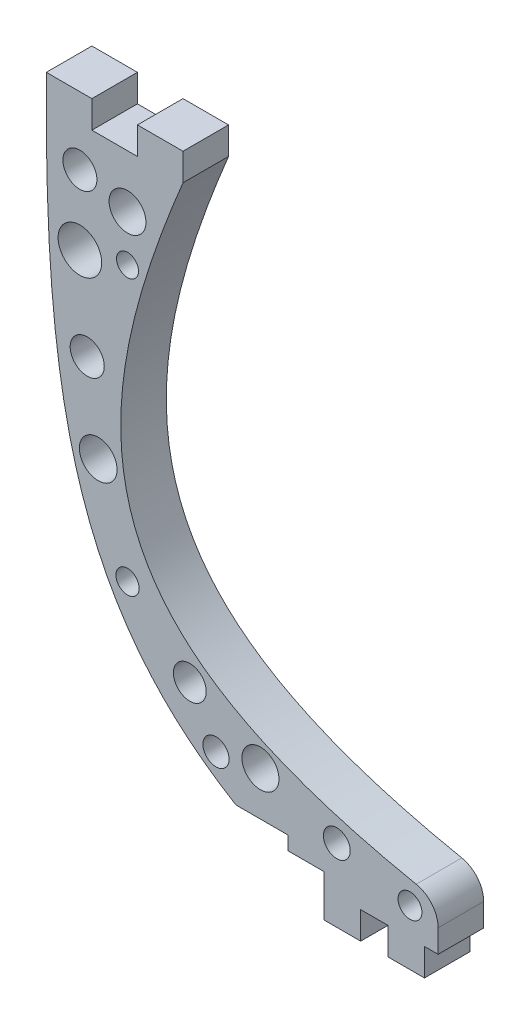
ISO-10303-21;
HEADER;
FILE_DESCRIPTION(('STEP AP214'),'2;1');
FILE_NAME('part.step','',(''),(''),'','','');
FILE_SCHEMA(('AUTOMOTIVE_DESIGN { 1 0 10303 214 1 1 1 1 }'));
ENDSEC;
DATA;
#1=APPLICATION_CONTEXT('core data for automotive mechanical design processes');
#2=APPLICATION_PROTOCOL_DEFINITION('international standard','automotive_design',2000,#1);
#3=PRODUCT_CONTEXT('',#1,'mechanical');
#4=PRODUCT('Part','Part','',(#3));
#5=PRODUCT_RELATED_PRODUCT_CATEGORY('part','',(#4));
#6=PRODUCT_DEFINITION_FORMATION('','',#4);
#7=PRODUCT_DEFINITION_CONTEXT('part definition',#1,'design');
#8=PRODUCT_DEFINITION('design','',#6,#7);
#9=PRODUCT_DEFINITION_SHAPE('','',#8);
#10=(LENGTH_UNIT() NAMED_UNIT(*) SI_UNIT(.MILLI.,.METRE.));
#11=(NAMED_UNIT(*) PLANE_ANGLE_UNIT() SI_UNIT($,.RADIAN.));
#12=(NAMED_UNIT(*) SI_UNIT($,.STERADIAN.) SOLID_ANGLE_UNIT());
#13=UNCERTAINTY_MEASURE_WITH_UNIT(LENGTH_MEASURE(1.E-05),#10,'distance_accuracy_value','');
#14=(GEOMETRIC_REPRESENTATION_CONTEXT(3) GLOBAL_UNCERTAINTY_ASSIGNED_CONTEXT((#13)) GLOBAL_UNIT_ASSIGNED_CONTEXT((#10,
#11,#12)) REPRESENTATION_CONTEXT('',''));
#15=CARTESIAN_POINT('',(0.,0.,0.));
#16=DIRECTION('',(0.,0.,1.));
#17=DIRECTION('',(1.,0.,0.));
#18=AXIS2_PLACEMENT_3D('',#15,#16,#17);
#19=CARTESIAN_POINT('',(0.,60.73,5.));
#20=DIRECTION('',(0.,-1.,0.));
#21=DIRECTION('',(1.,0.,0.));
#22=AXIS2_PLACEMENT_3D('',#19,#20,#21);
#23=PLANE('',#22);
#24=DIRECTION('',(-1.,0.,0.));
#25=VECTOR('',#24,1.);
#26=CARTESIAN_POINT('',(0.,60.73,0.));
#27=LINE('',#26,#25);
#28=CARTESIAN_POINT('',(-2.50000000000001,60.73,0.));
#29=VERTEX_POINT('',#28);
#30=CARTESIAN_POINT('',(-7.50000000000001,60.73,0.));
#31=VERTEX_POINT('',#30);
#32=EDGE_CURVE('E386',#29,#31,#27,.T.);
#33=ORIENTED_EDGE('',*,*,#32,.T.);
#34=DIRECTION('',(0.,0.,-1.));
#35=VECTOR('',#34,1.);
#36=CARTESIAN_POINT('',(-7.50000000000001,60.73,5.));
#37=LINE('',#36,#35);
#38=CARTESIAN_POINT('',(-7.50000000000001,60.73,5.));
#39=VERTEX_POINT('',#38);
#40=EDGE_CURVE('E480',#39,#31,#37,.T.);
#41=ORIENTED_EDGE('',*,*,#40,.F.);
#42=DIRECTION('',(-1.,0.,0.));
#43=VECTOR('',#42,1.);
#44=CARTESIAN_POINT('',(0.,60.73,5.));
#45=LINE('',#44,#43);
#46=CARTESIAN_POINT('',(-2.50000000000001,60.73,5.));
#47=VERTEX_POINT('',#46);
#48=EDGE_CURVE('E258',#47,#39,#45,.T.);
#49=ORIENTED_EDGE('',*,*,#48,.F.);
#50=DIRECTION('',(0.,0.,-1.));
#51=VECTOR('',#50,1.);
#52=CARTESIAN_POINT('',(-2.50000000000001,60.73,5.));
#53=LINE('',#52,#51);
#54=EDGE_CURVE('E443',#47,#29,#53,.T.);
#55=ORIENTED_EDGE('',*,*,#54,.T.);
#56=EDGE_LOOP('',(#33,#41,#49,#55));
#57=FACE_BOUND('',#56,.T.);
#58=ADVANCED_FACE('F41',(#57),#23,.F.);
#59=CARTESIAN_POINT('',(-7.4999999999999,0.,5.));
#60=DIRECTION('',(1.,0.,0.));
#61=DIRECTION('',(0.,1.,0.));
#62=AXIS2_PLACEMENT_3D('',#59,#60,#61);
#63=PLANE('',#62);
#64=DIRECTION('',(0.,-1.,0.));
#65=VECTOR('',#64,1.);
#66=CARTESIAN_POINT('',(-7.4999999999999,0.,0.));
#67=LINE('',#66,#65);
#68=CARTESIAN_POINT('',(-7.5,57.73,0.));
#69=VERTEX_POINT('',#68);
#70=EDGE_CURVE('E389',#31,#69,#67,.T.);
#71=ORIENTED_EDGE('',*,*,#70,.T.);
#72=DIRECTION('',(0.,0.,-1.));
#73=VECTOR('',#72,1.);
#74=CARTESIAN_POINT('',(-7.5,57.73,5.));
#75=LINE('',#74,#73);
#76=CARTESIAN_POINT('',(-7.5,57.73,5.));
#77=VERTEX_POINT('',#76);
#78=EDGE_CURVE('E477',#77,#69,#75,.T.);
#79=ORIENTED_EDGE('',*,*,#78,.F.);
#80=DIRECTION('',(0.,-1.,0.));
#81=VECTOR('',#80,1.);
#82=CARTESIAN_POINT('',(-7.4999999999999,0.,5.));
#83=LINE('',#82,#81);
#84=EDGE_CURVE('E261',#39,#77,#83,.T.);
#85=ORIENTED_EDGE('',*,*,#84,.F.);
#86=ORIENTED_EDGE('',*,*,#40,.T.);
#87=EDGE_LOOP('',(#71,#79,#85,#86));
#88=FACE_BOUND('',#87,.T.);
#89=ADVANCED_FACE('F280',(#88),#63,.F.);
#90=CARTESIAN_POINT('',(16.,0.,5.));
#91=CARTESIAN_POINT('',(-3.77704020854546,10.2634496775801,5.));
#92=CARTESIAN_POINT('',(-7.5,27.8008007988381,5.));
#93=CARTESIAN_POINT('',(-7.5,57.73,5.));
#94=B_SPLINE_CURVE_WITH_KNOTS('',3,(#90,#91,#92,#93),.UNSPECIFIED.,.F.,.F.,(4,4),(0.,1.),.UNSPECIFIED.);
#95=DIRECTION('',(0.,0.,-1.));
#96=VECTOR('',#95,1.);
#97=SURFACE_OF_LINEAR_EXTRUSION('',#94,#96);
#98=DIRECTION('',(0.,0.,1.));
#99=VECTOR('',#98,1.);
#100=CARTESIAN_POINT('',(13.3096736436413,1.5,0.));
#101=LINE('',#100,#99);
#102=CARTESIAN_POINT('',(13.3096736446142,1.49999999941704,0.));
#103=VERTEX_POINT('',#102);
#104=CARTESIAN_POINT('',(13.3096736436413,1.5,5.));
#105=VERTEX_POINT('',#104);
#106=EDGE_CURVE('E199',#103,#105,#101,.T.);
#107=ORIENTED_EDGE('',*,*,#106,.T.);
#108=EDGE_CURVE('E264',#105,#77,#94,.T.);
#109=ORIENTED_EDGE('',*,*,#108,.T.);
#110=ORIENTED_EDGE('',*,*,#78,.T.);
#111=CARTESIAN_POINT('',(16.,0.,0.));
#112=CARTESIAN_POINT('',(-3.77704020854546,10.2634496775801,0.));
#113=CARTESIAN_POINT('',(-7.5,27.8008007988381,0.));
#114=CARTESIAN_POINT('',(-7.5,57.73,0.));
#115=B_SPLINE_CURVE_WITH_KNOTS('',3,(#111,#112,#113,#114),.UNSPECIFIED.,.F.,.F.,(4,4),(0.,1.),.UNSPECIFIED.);
#116=EDGE_CURVE('E392',#103,#69,#115,.T.);
#117=ORIENTED_EDGE('',*,*,#116,.F.);
#118=EDGE_LOOP('',(#107,#109,#110,#117));
#119=FACE_BOUND('',#118,.T.);
#120=ADVANCED_FACE('F275',(#119),#97,.T.);
#121=CARTESIAN_POINT('',(0.,0.,5.));
#122=DIRECTION('',(0.,-1.,0.));
#123=DIRECTION('',(1.,0.,0.));
#124=AXIS2_PLACEMENT_3D('',#121,#122,#123);
#125=PLANE('',#124);
#126=DIRECTION('',(0.,0.,1.));
#127=VECTOR('',#126,1.);
#128=CARTESIAN_POINT('',(19.,0.,0.));
#129=LINE('',#128,#127);
#130=CARTESIAN_POINT('',(19.,0.,0.));
#131=VERTEX_POINT('',#130);
#132=CARTESIAN_POINT('',(19.,0.,5.));
#133=VERTEX_POINT('',#132);
#134=EDGE_CURVE('E217',#131,#133,#129,.T.);
#135=ORIENTED_EDGE('',*,*,#134,.F.);
#136=DIRECTION('',(-1.,0.,0.));
#137=VECTOR('',#136,1.);
#138=CARTESIAN_POINT('',(0.,0.,0.));
#139=LINE('',#138,#137);
#140=CARTESIAN_POINT('',(23.,0.,0.));
#141=VERTEX_POINT('',#140);
#142=EDGE_CURVE('E211',#141,#131,#139,.T.);
#143=ORIENTED_EDGE('',*,*,#142,.F.);
#144=DIRECTION('',(0.,0.,-1.));
#145=VECTOR('',#144,1.);
#146=CARTESIAN_POINT('',(23.,0.,5.));
#147=LINE('',#146,#145);
#148=CARTESIAN_POINT('',(23.,0.,5.));
#149=VERTEX_POINT('',#148);
#150=EDGE_CURVE('E475',#149,#141,#147,.T.);
#151=ORIENTED_EDGE('',*,*,#150,.F.);
#152=DIRECTION('',(-1.,0.,0.));
#153=VECTOR('',#152,1.);
#154=CARTESIAN_POINT('',(0.,0.,5.));
#155=LINE('',#154,#153);
#156=EDGE_CURVE('E269',#149,#133,#155,.T.);
#157=ORIENTED_EDGE('',*,*,#156,.T.);
#158=EDGE_LOOP('',(#135,#143,#151,#157));
#159=FACE_BOUND('',#158,.T.);
#160=ADVANCED_FACE('F279',(#159),#125,.T.);
#161=CARTESIAN_POINT('',(23.,0.,5.));
#162=DIRECTION('',(-1.,0.,0.));
#163=DIRECTION('',(0.,0.,1.));
#164=AXIS2_PLACEMENT_3D('',#161,#162,#163);
#165=PLANE('',#164);
#166=DIRECTION('',(0.,1.,0.));
#167=VECTOR('',#166,1.);
#168=CARTESIAN_POINT('',(23.,0.,0.));
#169=LINE('',#168,#167);
#170=CARTESIAN_POINT('',(23.,-4.6,0.));
#171=VERTEX_POINT('',#170);
#172=EDGE_CURVE('E400',#171,#141,#169,.T.);
#173=ORIENTED_EDGE('',*,*,#172,.F.);
#174=DIRECTION('',(0.,0.,-1.));
#175=VECTOR('',#174,1.);
#176=CARTESIAN_POINT('',(23.,-4.6,5.));
#177=LINE('',#176,#175);
#178=CARTESIAN_POINT('',(23.,-4.6,5.));
#179=VERTEX_POINT('',#178);
#180=EDGE_CURVE('E473',#179,#171,#177,.T.);
#181=ORIENTED_EDGE('',*,*,#180,.F.);
#182=DIRECTION('',(0.,1.,0.));
#183=VECTOR('',#182,1.);
#184=CARTESIAN_POINT('',(23.,0.,5.));
#185=LINE('',#184,#183);
#186=EDGE_CURVE('E596',#179,#149,#185,.T.);
#187=ORIENTED_EDGE('',*,*,#186,.T.);
#188=ORIENTED_EDGE('',*,*,#150,.T.);
#189=EDGE_LOOP('',(#173,#181,#187,#188));
#190=FACE_BOUND('',#189,.T.);
#191=ADVANCED_FACE('F577',(#190),#165,.T.);
#192=CARTESIAN_POINT('',(0.,-4.60000000000001,5.));
#193=DIRECTION('',(0.,-1.,0.));
#194=DIRECTION('',(1.,0.,0.));
#195=AXIS2_PLACEMENT_3D('',#192,#193,#194);
#196=PLANE('',#195);
#197=DIRECTION('',(-1.,0.,0.));
#198=VECTOR('',#197,1.);
#199=CARTESIAN_POINT('',(0.,-4.60000000000001,0.));
#200=LINE('',#199,#198);
#201=CARTESIAN_POINT('',(27.,-4.6,0.));
#202=VERTEX_POINT('',#201);
#203=EDGE_CURVE('E402',#202,#171,#200,.T.);
#204=ORIENTED_EDGE('',*,*,#203,.F.);
#205=DIRECTION('',(0.,0.,-1.));
#206=VECTOR('',#205,1.);
#207=CARTESIAN_POINT('',(27.,-4.6,5.));
#208=LINE('',#207,#206);
#209=CARTESIAN_POINT('',(27.,-4.6,5.));
#210=VERTEX_POINT('',#209);
#211=EDGE_CURVE('E471',#210,#202,#208,.T.);
#212=ORIENTED_EDGE('',*,*,#211,.F.);
#213=DIRECTION('',(-1.,0.,0.));
#214=VECTOR('',#213,1.);
#215=CARTESIAN_POINT('',(0.,-4.60000000000001,5.));
#216=LINE('',#215,#214);
#217=EDGE_CURVE('E592',#210,#179,#216,.T.);
#218=ORIENTED_EDGE('',*,*,#217,.T.);
#219=ORIENTED_EDGE('',*,*,#180,.T.);
#220=EDGE_LOOP('',(#204,#212,#218,#219));
#221=FACE_BOUND('',#220,.T.);
#222=ADVANCED_FACE('F574',(#221),#196,.T.);
#223=CARTESIAN_POINT('',(27.,0.,5.));
#224=DIRECTION('',(1.,0.,0.));
#225=DIRECTION('',(0.,0.,-1.));
#226=AXIS2_PLACEMENT_3D('',#223,#224,#225);
#227=PLANE('',#226);
#228=DIRECTION('',(0.,-1.,0.));
#229=VECTOR('',#228,1.);
#230=CARTESIAN_POINT('',(27.,0.,0.));
#231=LINE('',#230,#229);
#232=CARTESIAN_POINT('',(27.,-1.6,0.));
#233=VERTEX_POINT('',#232);
#234=EDGE_CURVE('E405',#233,#202,#231,.T.);
#235=ORIENTED_EDGE('',*,*,#234,.F.);
#236=DIRECTION('',(0.,0.,-1.));
#237=VECTOR('',#236,1.);
#238=CARTESIAN_POINT('',(27.,-1.6,5.));
#239=LINE('',#238,#237);
#240=CARTESIAN_POINT('',(27.,-1.6,5.));
#241=VERTEX_POINT('',#240);
#242=EDGE_CURVE('E469',#241,#233,#239,.T.);
#243=ORIENTED_EDGE('',*,*,#242,.F.);
#244=DIRECTION('',(0.,-1.,0.));
#245=VECTOR('',#244,1.);
#246=CARTESIAN_POINT('',(27.,0.,5.));
#247=LINE('',#246,#245);
#248=EDGE_CURVE('E595',#241,#210,#247,.T.);
#249=ORIENTED_EDGE('',*,*,#248,.T.);
#250=ORIENTED_EDGE('',*,*,#211,.T.);
#251=EDGE_LOOP('',(#235,#243,#249,#250));
#252=FACE_BOUND('',#251,.T.);
#253=ADVANCED_FACE('F570',(#252),#227,.T.);
#254=CARTESIAN_POINT('',(0.,-1.6,5.));
#255=DIRECTION('',(0.,-1.,0.));
#256=DIRECTION('',(0.,0.,-1.));
#257=AXIS2_PLACEMENT_3D('',#254,#255,#256);
#258=PLANE('',#257);
#259=DIRECTION('',(-1.,0.,0.));
#260=VECTOR('',#259,1.);
#261=CARTESIAN_POINT('',(0.,-1.6,0.));
#262=LINE('',#261,#260);
#263=CARTESIAN_POINT('',(30.,-1.6,0.));
#264=VERTEX_POINT('',#263);
#265=EDGE_CURVE('E408',#264,#233,#262,.T.);
#266=ORIENTED_EDGE('',*,*,#265,.F.);
#267=DIRECTION('',(0.,0.,-1.));
#268=VECTOR('',#267,1.);
#269=CARTESIAN_POINT('',(30.,-1.6,5.));
#270=LINE('',#269,#268);
#271=CARTESIAN_POINT('',(30.,-1.6,5.));
#272=VERTEX_POINT('',#271);
#273=EDGE_CURVE('E467',#272,#264,#270,.T.);
#274=ORIENTED_EDGE('',*,*,#273,.F.);
#275=DIRECTION('',(-1.,0.,0.));
#276=VECTOR('',#275,1.);
#277=CARTESIAN_POINT('',(0.,-1.6,5.));
#278=LINE('',#277,#276);
#279=EDGE_CURVE('E598',#272,#241,#278,.T.);
#280=ORIENTED_EDGE('',*,*,#279,.T.);
#281=ORIENTED_EDGE('',*,*,#242,.T.);
#282=EDGE_LOOP('',(#266,#274,#280,#281));
#283=FACE_BOUND('',#282,.T.);
#284=ADVANCED_FACE('F566',(#283),#258,.T.);
#285=CARTESIAN_POINT('',(30.,0.,5.));
#286=DIRECTION('',(-1.,0.,0.));
#287=DIRECTION('',(0.,0.,1.));
#288=AXIS2_PLACEMENT_3D('',#285,#286,#287);
#289=PLANE('',#288);
#290=DIRECTION('',(0.,1.,0.));
#291=VECTOR('',#290,1.);
#292=CARTESIAN_POINT('',(30.,0.,0.));
#293=LINE('',#292,#291);
#294=CARTESIAN_POINT('',(30.,-4.6,0.));
#295=VERTEX_POINT('',#294);
#296=EDGE_CURVE('E411',#295,#264,#293,.T.);
#297=ORIENTED_EDGE('',*,*,#296,.F.);
#298=DIRECTION('',(0.,0.,-1.));
#299=VECTOR('',#298,1.);
#300=CARTESIAN_POINT('',(30.,-4.6,5.));
#301=LINE('',#300,#299);
#302=CARTESIAN_POINT('',(30.,-4.6,5.));
#303=VERTEX_POINT('',#302);
#304=EDGE_CURVE('E465',#303,#295,#301,.T.);
#305=ORIENTED_EDGE('',*,*,#304,.F.);
#306=DIRECTION('',(0.,1.,0.));
#307=VECTOR('',#306,1.);
#308=CARTESIAN_POINT('',(30.,0.,5.));
#309=LINE('',#308,#307);
#310=EDGE_CURVE('E603',#303,#272,#309,.T.);
#311=ORIENTED_EDGE('',*,*,#310,.T.);
#312=ORIENTED_EDGE('',*,*,#273,.T.);
#313=EDGE_LOOP('',(#297,#305,#311,#312));
#314=FACE_BOUND('',#313,.T.);
#315=ADVANCED_FACE('F562',(#314),#289,.T.);
#316=CARTESIAN_POINT('',(0.,-4.59999999999999,5.));
#317=DIRECTION('',(0.,-1.,0.));
#318=DIRECTION('',(1.,0.,0.));
#319=AXIS2_PLACEMENT_3D('',#316,#317,#318);
#320=PLANE('',#319);
#321=DIRECTION('',(-1.,0.,0.));
#322=VECTOR('',#321,1.);
#323=CARTESIAN_POINT('',(0.,-4.59999999999999,0.));
#324=LINE('',#323,#322);
#325=CARTESIAN_POINT('',(34.,-4.6,0.));
#326=VERTEX_POINT('',#325);
#327=EDGE_CURVE('E414',#326,#295,#324,.T.);
#328=ORIENTED_EDGE('',*,*,#327,.F.);
#329=DIRECTION('',(0.,0.,-1.));
#330=VECTOR('',#329,1.);
#331=CARTESIAN_POINT('',(34.,-4.6,5.));
#332=LINE('',#331,#330);
#333=CARTESIAN_POINT('',(34.,-4.6,5.));
#334=VERTEX_POINT('',#333);
#335=EDGE_CURVE('E463',#334,#326,#332,.T.);
#336=ORIENTED_EDGE('',*,*,#335,.F.);
#337=DIRECTION('',(-1.,0.,0.));
#338=VECTOR('',#337,1.);
#339=CARTESIAN_POINT('',(0.,-4.59999999999999,5.));
#340=LINE('',#339,#338);
#341=EDGE_CURVE('E606',#334,#303,#340,.T.);
#342=ORIENTED_EDGE('',*,*,#341,.T.);
#343=ORIENTED_EDGE('',*,*,#304,.T.);
#344=EDGE_LOOP('',(#328,#336,#342,#343));
#345=FACE_BOUND('',#344,.T.);
#346=ADVANCED_FACE('F558',(#345),#320,.T.);
#347=CARTESIAN_POINT('',(34.,0.,5.));
#348=DIRECTION('',(-1.,0.,0.));
#349=DIRECTION('',(0.,0.,1.));
#350=AXIS2_PLACEMENT_3D('',#347,#348,#349);
#351=PLANE('',#350);
#352=DIRECTION('',(0.,1.,0.));
#353=VECTOR('',#352,1.);
#354=CARTESIAN_POINT('',(34.,0.,0.));
#355=LINE('',#354,#353);
#356=CARTESIAN_POINT('',(34.,-1.6,0.));
#357=VERTEX_POINT('',#356);
#358=EDGE_CURVE('E417',#326,#357,#355,.T.);
#359=ORIENTED_EDGE('',*,*,#358,.T.);
#360=DIRECTION('',(0.,0.,-1.));
#361=VECTOR('',#360,1.);
#362=CARTESIAN_POINT('',(34.,-1.6,5.));
#363=LINE('',#362,#361);
#364=CARTESIAN_POINT('',(34.,-1.6,5.));
#365=VERTEX_POINT('',#364);
#366=EDGE_CURVE('E460',#365,#357,#363,.T.);
#367=ORIENTED_EDGE('',*,*,#366,.F.);
#368=DIRECTION('',(0.,1.,0.));
#369=VECTOR('',#368,1.);
#370=CARTESIAN_POINT('',(34.,0.,5.));
#371=LINE('',#370,#369);
#372=EDGE_CURVE('E609',#334,#365,#371,.T.);
#373=ORIENTED_EDGE('',*,*,#372,.F.);
#374=ORIENTED_EDGE('',*,*,#335,.T.);
#375=EDGE_LOOP('',(#359,#367,#373,#374));
#376=FACE_BOUND('',#375,.T.);
#377=ADVANCED_FACE('F554',(#376),#351,.F.);
#378=CARTESIAN_POINT('',(0.,-1.60000000000005,5.));
#379=DIRECTION('',(0.,1.,0.));
#380=DIRECTION('',(-1.,0.,0.));
#381=AXIS2_PLACEMENT_3D('',#378,#379,#380);
#382=PLANE('',#381);
#383=DIRECTION('',(1.,0.,0.));
#384=VECTOR('',#383,1.);
#385=CARTESIAN_POINT('',(0.,-1.60000000000005,0.));
#386=LINE('',#385,#384);
#387=CARTESIAN_POINT('',(35.5,-1.59999999999999,0.));
#388=VERTEX_POINT('',#387);
#389=EDGE_CURVE('E419',#357,#388,#386,.T.);
#390=ORIENTED_EDGE('',*,*,#389,.T.);
#391=DIRECTION('',(0.,0.,-1.));
#392=VECTOR('',#391,1.);
#393=CARTESIAN_POINT('',(35.5,-1.59999999999999,5.));
#394=LINE('',#393,#392);
#395=CARTESIAN_POINT('',(35.5,-1.59999999999999,5.));
#396=VERTEX_POINT('',#395);
#397=EDGE_CURVE('E457',#396,#388,#394,.T.);
#398=ORIENTED_EDGE('',*,*,#397,.F.);
#399=DIRECTION('',(1.,0.,0.));
#400=VECTOR('',#399,1.);
#401=CARTESIAN_POINT('',(0.,-1.60000000000005,5.));
#402=LINE('',#401,#400);
#403=EDGE_CURVE('E611',#365,#396,#402,.T.);
#404=ORIENTED_EDGE('',*,*,#403,.F.);
#405=ORIENTED_EDGE('',*,*,#366,.T.);
#406=EDGE_LOOP('',(#390,#398,#404,#405));
#407=FACE_BOUND('',#406,.T.);
#408=ADVANCED_FACE('F551',(#407),#382,.F.);
#409=CARTESIAN_POINT('',(35.5,0.,5.));
#410=DIRECTION('',(-1.,0.,0.));
#411=DIRECTION('',(0.,0.,1.));
#412=AXIS2_PLACEMENT_3D('',#409,#410,#411);
#413=PLANE('',#412);
#414=DIRECTION('',(0.,1.,0.));
#415=VECTOR('',#414,1.);
#416=CARTESIAN_POINT('',(35.5,0.,0.));
#417=LINE('',#416,#415);
#418=CARTESIAN_POINT('',(35.5,0.92158938114513,0.));
#419=VERTEX_POINT('',#418);
#420=EDGE_CURVE('E421',#388,#419,#417,.T.);
#421=ORIENTED_EDGE('',*,*,#420,.T.);
#422=DIRECTION('',(0.,0.,-1.));
#423=VECTOR('',#422,1.);
#424=CARTESIAN_POINT('',(35.5,0.92158938114513,5.));
#425=LINE('',#424,#423);
#426=CARTESIAN_POINT('',(35.5,0.92158938114513,5.));
#427=VERTEX_POINT('',#426);
#428=EDGE_CURVE('E49',#419,#427,#425,.F.);
#429=ORIENTED_EDGE('',*,*,#428,.T.);
#430=DIRECTION('',(0.,1.,0.));
#431=VECTOR('',#430,1.);
#432=CARTESIAN_POINT('',(35.5,0.,5.));
#433=LINE('',#432,#431);
#434=EDGE_CURVE('E509',#396,#427,#433,.T.);
#435=ORIENTED_EDGE('',*,*,#434,.F.);
#436=ORIENTED_EDGE('',*,*,#397,.T.);
#437=EDGE_LOOP('',(#421,#429,#435,#436));
#438=FACE_BOUND('',#437,.T.);
#439=ADVANCED_FACE('F548',(#438),#413,.F.);
#440=CARTESIAN_POINT('',(35.5,3.40000000000001,5.));
#441=CARTESIAN_POINT('',(-1.77551263511542,10.2127809119285,5.));
#442=CARTESIAN_POINT('',(-5.56714412286545,26.4266994921749,5.));
#443=CARTESIAN_POINT('',(7.5,57.73,5.));
#444=B_SPLINE_CURVE_WITH_KNOTS('',3,(#440,#441,#442,#443),.UNSPECIFIED.,.F.,.F.,(4,4),(0.,1.),.UNSPECIFIED.);
#445=DIRECTION('',(0.,0.,-1.));
#446=VECTOR('',#445,1.);
#447=SURFACE_OF_LINEAR_EXTRUSION('',#444,#446);
#448=CARTESIAN_POINT('',(33.0935226947651,3.86229181607437,5.));
#449=VERTEX_POINT('',#448);
#450=CARTESIAN_POINT('',(7.5,57.73,5.));
#451=VERTEX_POINT('',#450);
#452=EDGE_CURVE('E491',#449,#451,#444,.T.);
#453=ORIENTED_EDGE('',*,*,#452,.F.);
#454=DIRECTION('',(0.,0.,-1.));
#455=VECTOR('',#454,1.);
#456=CARTESIAN_POINT('',(33.0935226947651,3.86229181607437,5.));
#457=LINE('',#456,#455);
#458=CARTESIAN_POINT('',(33.0935226947651,3.86229181607437,0.));
#459=VERTEX_POINT('',#458);
#460=EDGE_CURVE('E483',#449,#459,#457,.T.);
#461=ORIENTED_EDGE('',*,*,#460,.T.);
#462=CARTESIAN_POINT('',(35.5,3.40000000000001,0.));
#463=CARTESIAN_POINT('',(-1.77551263511542,10.2127809119285,0.));
#464=CARTESIAN_POINT('',(-5.56714412286545,26.4266994921749,0.));
#465=CARTESIAN_POINT('',(7.5,57.73,0.));
#466=B_SPLINE_CURVE_WITH_KNOTS('',3,(#462,#463,#464,#465),.UNSPECIFIED.,.F.,.F.,(4,4),(0.,1.),.UNSPECIFIED.);
#467=CARTESIAN_POINT('',(7.5,57.73,0.));
#468=VERTEX_POINT('',#467);
#469=EDGE_CURVE('E423',#459,#468,#466,.T.);
#470=ORIENTED_EDGE('',*,*,#469,.T.);
#471=DIRECTION('',(0.,0.,-1.));
#472=VECTOR('',#471,1.);
#473=CARTESIAN_POINT('',(7.5,57.73,5.));
#474=LINE('',#473,#472);
#475=EDGE_CURVE('E454',#451,#468,#474,.T.);
#476=ORIENTED_EDGE('',*,*,#475,.F.);
#477=EDGE_LOOP('',(#453,#461,#470,#476));
#478=FACE_BOUND('',#477,.T.);
#479=ADVANCED_FACE('F489',(#478),#447,.F.);
#480=CARTESIAN_POINT('',(7.50000000000014,0.,5.));
#481=DIRECTION('',(1.,0.,0.));
#482=DIRECTION('',(0.,1.,0.));
#483=AXIS2_PLACEMENT_3D('',#480,#481,#482);
#484=PLANE('',#483);
#485=DIRECTION('',(0.,-1.,0.));
#486=VECTOR('',#485,1.);
#487=CARTESIAN_POINT('',(7.50000000000014,0.,0.));
#488=LINE('',#487,#486);
#489=CARTESIAN_POINT('',(7.49999999999999,60.73,0.));
#490=VERTEX_POINT('',#489);
#491=EDGE_CURVE('E427',#490,#468,#488,.T.);
#492=ORIENTED_EDGE('',*,*,#491,.F.);
#493=DIRECTION('',(0.,0.,-1.));
#494=VECTOR('',#493,1.);
#495=CARTESIAN_POINT('',(7.49999999999999,60.73,5.));
#496=LINE('',#495,#494);
#497=CARTESIAN_POINT('',(7.49999999999999,60.73,5.));
#498=VERTEX_POINT('',#497);
#499=EDGE_CURVE('E452',#498,#490,#496,.T.);
#500=ORIENTED_EDGE('',*,*,#499,.F.);
#501=DIRECTION('',(0.,-1.,0.));
#502=VECTOR('',#501,1.);
#503=CARTESIAN_POINT('',(7.50000000000014,0.,5.));
#504=LINE('',#503,#502);
#505=EDGE_CURVE('E501',#498,#451,#504,.T.);
#506=ORIENTED_EDGE('',*,*,#505,.T.);
#507=ORIENTED_EDGE('',*,*,#475,.T.);
#508=EDGE_LOOP('',(#492,#500,#506,#507));
#509=FACE_BOUND('',#508,.T.);
#510=ADVANCED_FACE('F498',(#509),#484,.T.);
#511=CARTESIAN_POINT('',(0.,60.73,5.));
#512=DIRECTION('',(0.,1.,0.));
#513=DIRECTION('',(-1.,0.,0.));
#514=AXIS2_PLACEMENT_3D('',#511,#512,#513);
#515=PLANE('',#514);
#516=DIRECTION('',(1.,0.,0.));
#517=VECTOR('',#516,1.);
#518=CARTESIAN_POINT('',(0.,60.73,0.));
#519=LINE('',#518,#517);
#520=CARTESIAN_POINT('',(2.49999999999999,60.73,0.));
#521=VERTEX_POINT('',#520);
#522=EDGE_CURVE('E433',#521,#490,#519,.T.);
#523=ORIENTED_EDGE('',*,*,#522,.F.);
#524=DIRECTION('',(0.,0.,-1.));
#525=VECTOR('',#524,1.);
#526=CARTESIAN_POINT('',(2.49999999999999,60.73,5.));
#527=LINE('',#526,#525);
#528=CARTESIAN_POINT('',(2.49999999999999,60.73,5.));
#529=VERTEX_POINT('',#528);
#530=EDGE_CURVE('E450',#529,#521,#527,.T.);
#531=ORIENTED_EDGE('',*,*,#530,.F.);
#532=DIRECTION('',(1.,0.,0.));
#533=VECTOR('',#532,1.);
#534=CARTESIAN_POINT('',(0.,60.73,5.));
#535=LINE('',#534,#533);
#536=EDGE_CURVE('E505',#529,#498,#535,.T.);
#537=ORIENTED_EDGE('',*,*,#536,.T.);
#538=ORIENTED_EDGE('',*,*,#499,.T.);
#539=EDGE_LOOP('',(#523,#531,#537,#538));
#540=FACE_BOUND('',#539,.T.);
#541=ADVANCED_FACE('F535',(#540),#515,.T.);
#542=CARTESIAN_POINT('',(2.5000000000001,0.,5.));
#543=DIRECTION('',(1.,0.,0.));
#544=DIRECTION('',(0.,1.,0.));
#545=AXIS2_PLACEMENT_3D('',#542,#543,#544);
#546=PLANE('',#545);
#547=DIRECTION('',(0.,-1.,0.));
#548=VECTOR('',#547,1.);
#549=CARTESIAN_POINT('',(2.5000000000001,0.,0.));
#550=LINE('',#549,#548);
#551=CARTESIAN_POINT('',(2.5,57.73,0.));
#552=VERTEX_POINT('',#551);
#553=EDGE_CURVE('E436',#521,#552,#550,.T.);
#554=ORIENTED_EDGE('',*,*,#553,.T.);
#555=DIRECTION('',(0.,0.,-1.));
#556=VECTOR('',#555,1.);
#557=CARTESIAN_POINT('',(2.5,57.73,5.));
#558=LINE('',#557,#556);
#559=CARTESIAN_POINT('',(2.5,57.73,5.));
#560=VERTEX_POINT('',#559);
#561=EDGE_CURVE('E448',#560,#552,#558,.T.);
#562=ORIENTED_EDGE('',*,*,#561,.F.);
#563=DIRECTION('',(0.,-1.,0.));
#564=VECTOR('',#563,1.);
#565=CARTESIAN_POINT('',(2.5000000000001,0.,5.));
#566=LINE('',#565,#564);
#567=EDGE_CURVE('E507',#529,#560,#566,.T.);
#568=ORIENTED_EDGE('',*,*,#567,.F.);
#569=ORIENTED_EDGE('',*,*,#530,.T.);
#570=EDGE_LOOP('',(#554,#562,#568,#569));
#571=FACE_BOUND('',#570,.T.);
#572=ADVANCED_FACE('F533',(#571),#546,.F.);
#573=CARTESIAN_POINT('',(-1.60232938029026E-13,57.73,5.));
#574=DIRECTION('',(0.,1.,0.));
#575=DIRECTION('',(-1.,0.,0.));
#576=AXIS2_PLACEMENT_3D('',#573,#574,#575);
#577=PLANE('',#576);
#578=DIRECTION('',(1.,0.,0.));
#579=VECTOR('',#578,1.);
#580=CARTESIAN_POINT('',(-1.60232938029026E-13,57.73,0.));
#581=LINE('',#580,#579);
#582=CARTESIAN_POINT('',(-2.5,57.73,0.));
#583=VERTEX_POINT('',#582);
#584=EDGE_CURVE('E439',#583,#552,#581,.T.);
#585=ORIENTED_EDGE('',*,*,#584,.F.);
#586=DIRECTION('',(0.,0.,-1.));
#587=VECTOR('',#586,1.);
#588=CARTESIAN_POINT('',(-2.5,57.73,5.));
#589=LINE('',#588,#587);
#590=CARTESIAN_POINT('',(-2.5,57.73,5.));
#591=VERTEX_POINT('',#590);
#592=EDGE_CURVE('E446',#591,#583,#589,.T.);
#593=ORIENTED_EDGE('',*,*,#592,.F.);
#594=DIRECTION('',(1.,0.,0.));
#595=VECTOR('',#594,1.);
#596=CARTESIAN_POINT('',(-1.60232938029026E-13,57.73,5.));
#597=LINE('',#596,#595);
#598=EDGE_CURVE('E516',#591,#560,#597,.T.);
#599=ORIENTED_EDGE('',*,*,#598,.T.);
#600=ORIENTED_EDGE('',*,*,#561,.T.);
#601=EDGE_LOOP('',(#585,#593,#599,#600));
#602=FACE_BOUND('',#601,.T.);
#603=ADVANCED_FACE('F293',(#602),#577,.T.);
#604=CARTESIAN_POINT('',(32.4136496448366,1.49160531398054,5.));
#605=DIRECTION('',(0.,0.,-1.));
#606=DIRECTION('',(-1.,0.,0.));
#607=AXIS2_PLACEMENT_3D('',#604,#605,#606);
#608=CYLINDRICAL_SURFACE('',#607,1.31161038967836);
#609=CARTESIAN_POINT('',(32.4136496448366,1.49160531398054,5.));
#610=DIRECTION('',(0.,0.,1.));
#611=DIRECTION('',(1.,0.,0.));
#612=AXIS2_PLACEMENT_3D('',#609,#610,#611);
#613=CIRCLE('',#612,1.31161038967836);
#614=CARTESIAN_POINT('',(33.7252600345149,1.49160531398054,5.));
#615=VERTEX_POINT('',#614);
#616=EDGE_CURVE('E255',#615,#615,#613,.T.);
#617=ORIENTED_EDGE('',*,*,#616,.T.);
#618=EDGE_LOOP('',(#617));
#619=FACE_BOUND('',#618,.T.);
#620=CARTESIAN_POINT('',(32.4136496448366,1.49160531398054,0.));
#621=DIRECTION('',(0.,0.,1.));
#622=DIRECTION('',(1.,0.,0.));
#623=AXIS2_PLACEMENT_3D('',#620,#621,#622);
#624=CIRCLE('',#623,1.31161038967836);
#625=CARTESIAN_POINT('',(33.7252600345149,1.49160531398054,0.));
#626=VERTEX_POINT('',#625);
#627=EDGE_CURVE('E383',#626,#626,#624,.T.);
#628=ORIENTED_EDGE('',*,*,#627,.F.);
#629=EDGE_LOOP('',(#628));
#630=FACE_BOUND('',#629,.T.);
#631=ADVANCED_FACE('F289',(#619,#630),#608,.F.);
#632=CARTESIAN_POINT('',(24.3837226778,3.4,5.));
#633=DIRECTION('',(0.,0.,-1.));
#634=DIRECTION('',(-1.,0.,0.));
#635=AXIS2_PLACEMENT_3D('',#632,#633,#634);
#636=CYLINDRICAL_SURFACE('',#635,1.47248067420439);
#637=CARTESIAN_POINT('',(24.3837226778,3.4,5.));
#638=DIRECTION('',(0.,0.,1.));
#639=DIRECTION('',(1.,0.,0.));
#640=AXIS2_PLACEMENT_3D('',#637,#638,#639);
#641=CIRCLE('',#640,1.47248067420439);
#642=CARTESIAN_POINT('',(25.8562033520044,3.4,5.));
#643=VERTEX_POINT('',#642);
#644=EDGE_CURVE('E252',#643,#643,#641,.T.);
#645=ORIENTED_EDGE('',*,*,#644,.T.);
#646=EDGE_LOOP('',(#645));
#647=FACE_BOUND('',#646,.T.);
#648=CARTESIAN_POINT('',(24.3837226778,3.4,0.));
#649=DIRECTION('',(0.,0.,1.));
#650=DIRECTION('',(1.,0.,0.));
#651=AXIS2_PLACEMENT_3D('',#648,#649,#650);
#652=CIRCLE('',#651,1.47248067420439);
#653=CARTESIAN_POINT('',(25.8562033520044,3.4,0.));
#654=VERTEX_POINT('',#653);
#655=EDGE_CURVE('E380',#654,#654,#652,.T.);
#656=ORIENTED_EDGE('',*,*,#655,.F.);
#657=EDGE_LOOP('',(#656));
#658=FACE_BOUND('',#657,.T.);
#659=ADVANCED_FACE('F292',(#647,#658),#636,.F.);
#660=CARTESIAN_POINT('',(16.,6.32283628414746,5.));
#661=DIRECTION('',(0.,0.,-1.));
#662=DIRECTION('',(-1.,0.,0.));
#663=AXIS2_PLACEMENT_3D('',#660,#661,#662);
#664=CYLINDRICAL_SURFACE('',#663,2.03177799227082);
#665=CARTESIAN_POINT('',(16.,6.32283628414746,5.));
#666=DIRECTION('',(0.,0.,1.));
#667=DIRECTION('',(1.,0.,0.));
#668=AXIS2_PLACEMENT_3D('',#665,#666,#667);
#669=CIRCLE('',#668,2.03177799227082);
#670=CARTESIAN_POINT('',(18.0317779922708,6.32283628414746,5.));
#671=VERTEX_POINT('',#670);
#672=EDGE_CURVE('E249',#671,#671,#669,.T.);
#673=ORIENTED_EDGE('',*,*,#672,.T.);
#674=EDGE_LOOP('',(#673));
#675=FACE_BOUND('',#674,.T.);
#676=CARTESIAN_POINT('',(16.,6.32283628414746,0.));
#677=DIRECTION('',(0.,0.,1.));
#678=DIRECTION('',(1.,0.,0.));
#679=AXIS2_PLACEMENT_3D('',#676,#677,#678);
#680=CIRCLE('',#679,2.03177799227082);
#681=CARTESIAN_POINT('',(18.0317779922708,6.32283628414746,0.));
#682=VERTEX_POINT('',#681);
#683=EDGE_CURVE('E377',#682,#682,#680,.T.);
#684=ORIENTED_EDGE('',*,*,#683,.F.);
#685=EDGE_LOOP('',(#684));
#686=FACE_BOUND('',#685,.T.);
#687=ADVANCED_FACE('F297',(#675,#686),#664,.F.);
#688=CARTESIAN_POINT('',(11.1194843732918,5.46122647863145,5.));
#689=DIRECTION('',(0.,0.,-1.));
#690=DIRECTION('',(-1.,0.,0.));
#691=AXIS2_PLACEMENT_3D('',#688,#689,#690);
#692=CYLINDRICAL_SURFACE('',#691,1.43601634252668);
#693=CARTESIAN_POINT('',(11.1194843732918,5.46122647863145,5.));
#694=DIRECTION('',(0.,0.,1.));
#695=DIRECTION('',(1.,0.,0.));
#696=AXIS2_PLACEMENT_3D('',#693,#694,#695);
#697=CIRCLE('',#696,1.43601634252668);
#698=CARTESIAN_POINT('',(12.5555007158185,5.46122647863145,5.));
#699=VERTEX_POINT('',#698);
#700=EDGE_CURVE('E246',#699,#699,#697,.T.);
#701=ORIENTED_EDGE('',*,*,#700,.T.);
#702=EDGE_LOOP('',(#701));
#703=FACE_BOUND('',#702,.T.);
#704=CARTESIAN_POINT('',(11.1194843732918,5.46122647863145,0.));
#705=DIRECTION('',(0.,0.,1.));
#706=DIRECTION('',(1.,0.,0.));
#707=AXIS2_PLACEMENT_3D('',#704,#705,#706);
#708=CIRCLE('',#707,1.43601634252668);
#709=CARTESIAN_POINT('',(12.5555007158185,5.46122647863145,0.));
#710=VERTEX_POINT('',#709);
#711=EDGE_CURVE('E374',#710,#710,#708,.T.);
#712=ORIENTED_EDGE('',*,*,#711,.F.);
#713=EDGE_LOOP('',(#712));
#714=FACE_BOUND('',#713,.T.);
#715=ADVANCED_FACE('F301',(#703,#714),#692,.F.);
#716=CARTESIAN_POINT('',(8.24745168823847,10.6308853117275,5.));
#717=DIRECTION('',(0.,0.,-1.));
#718=DIRECTION('',(-1.,0.,0.));
#719=AXIS2_PLACEMENT_3D('',#716,#717,#718);
#720=CYLINDRICAL_SURFACE('',#719,1.799094092134);
#721=CARTESIAN_POINT('',(8.24745168823847,10.6308853117275,5.));
#722=DIRECTION('',(0.,0.,1.));
#723=DIRECTION('',(1.,0.,0.));
#724=AXIS2_PLACEMENT_3D('',#721,#722,#723);
#725=CIRCLE('',#724,1.799094092134);
#726=CARTESIAN_POINT('',(10.0465457803725,10.6308853117275,5.));
#727=VERTEX_POINT('',#726);
#728=EDGE_CURVE('E243',#727,#727,#725,.T.);
#729=ORIENTED_EDGE('',*,*,#728,.T.);
#730=EDGE_LOOP('',(#729));
#731=FACE_BOUND('',#730,.T.);
#732=CARTESIAN_POINT('',(8.24745168823847,10.6308853117275,0.));
#733=DIRECTION('',(0.,0.,1.));
#734=DIRECTION('',(1.,0.,0.));
#735=AXIS2_PLACEMENT_3D('',#732,#733,#734);
#736=CIRCLE('',#735,1.799094092134);
#737=CARTESIAN_POINT('',(10.0465457803725,10.6308853117275,0.));
#738=VERTEX_POINT('',#737);
#739=EDGE_CURVE('E371',#738,#738,#736,.T.);
#740=ORIENTED_EDGE('',*,*,#739,.F.);
#741=EDGE_LOOP('',(#740));
#742=FACE_BOUND('',#741,.T.);
#743=ADVANCED_FACE('F305',(#731,#742),#720,.F.);
#744=CARTESIAN_POINT('',(1.41201389781147,16.7770352577417,5.));
#745=DIRECTION('',(0.,0.,-1.));
#746=DIRECTION('',(-1.,0.,0.));
#747=AXIS2_PLACEMENT_3D('',#744,#745,#746);
#748=CYLINDRICAL_SURFACE('',#747,1.27150307189047);
#749=CARTESIAN_POINT('',(1.41201389781147,16.7770352577417,5.));
#750=DIRECTION('',(0.,0.,1.));
#751=DIRECTION('',(1.,0.,0.));
#752=AXIS2_PLACEMENT_3D('',#749,#750,#751);
#753=CIRCLE('',#752,1.27150307189047);
#754=CARTESIAN_POINT('',(2.68351696970194,16.7770352577417,5.));
#755=VERTEX_POINT('',#754);
#756=EDGE_CURVE('E240',#755,#755,#753,.T.);
#757=ORIENTED_EDGE('',*,*,#756,.T.);
#758=EDGE_LOOP('',(#757));
#759=FACE_BOUND('',#758,.T.);
#760=CARTESIAN_POINT('',(1.41201389781147,16.7770352577417,0.));
#761=DIRECTION('',(0.,0.,1.));
#762=DIRECTION('',(1.,0.,0.));
#763=AXIS2_PLACEMENT_3D('',#760,#761,#762);
#764=CIRCLE('',#763,1.27150307189047);
#765=CARTESIAN_POINT('',(2.68351696970194,16.7770352577417,0.));
#766=VERTEX_POINT('',#765);
#767=EDGE_CURVE('E368',#766,#766,#764,.T.);
#768=ORIENTED_EDGE('',*,*,#767,.F.);
#769=EDGE_LOOP('',(#768));
#770=FACE_BOUND('',#769,.T.);
#771=ADVANCED_FACE('F309',(#759,#770),#748,.F.);
#772=CARTESIAN_POINT('',(-1.8046627094483,26.8291496554285,5.));
#773=DIRECTION('',(0.,0.,-1.));
#774=DIRECTION('',(-1.,0.,0.));
#775=AXIS2_PLACEMENT_3D('',#772,#773,#774);
#776=CYLINDRICAL_SURFACE('',#775,2.06786353323842);
#777=CARTESIAN_POINT('',(-1.8046627094483,26.8291496554285,5.));
#778=DIRECTION('',(0.,0.,1.));
#779=DIRECTION('',(1.,0.,0.));
#780=AXIS2_PLACEMENT_3D('',#777,#778,#779);
#781=CIRCLE('',#780,2.06786353323842);
#782=CARTESIAN_POINT('',(0.263200823790118,26.8291496554285,5.));
#783=VERTEX_POINT('',#782);
#784=EDGE_CURVE('E237',#783,#783,#781,.T.);
#785=ORIENTED_EDGE('',*,*,#784,.T.);
#786=EDGE_LOOP('',(#785));
#787=FACE_BOUND('',#786,.T.);
#788=CARTESIAN_POINT('',(-1.8046627094483,26.8291496554285,0.));
#789=DIRECTION('',(0.,0.,1.));
#790=DIRECTION('',(1.,0.,0.));
#791=AXIS2_PLACEMENT_3D('',#788,#789,#790);
#792=CIRCLE('',#791,2.06786353323842);
#793=CARTESIAN_POINT('',(0.263200823790118,26.8291496554285,0.));
#794=VERTEX_POINT('',#793);
#795=EDGE_CURVE('E365',#794,#794,#792,.T.);
#796=ORIENTED_EDGE('',*,*,#795,.F.);
#797=EDGE_LOOP('',(#796));
#798=FACE_BOUND('',#797,.T.);
#799=ADVANCED_FACE('F313',(#787,#798),#776,.F.);
#800=CARTESIAN_POINT('',(-3.01091643717072,35.9622135938982,5.));
#801=DIRECTION('',(0.,0.,-1.));
#802=DIRECTION('',(-1.,0.,0.));
#803=AXIS2_PLACEMENT_3D('',#800,#801,#802);
#804=CYLINDRICAL_SURFACE('',#803,1.87013219304473);
#805=CARTESIAN_POINT('',(-3.01091643717072,35.9622135938982,5.));
#806=DIRECTION('',(0.,0.,1.));
#807=DIRECTION('',(1.,0.,0.));
#808=AXIS2_PLACEMENT_3D('',#805,#806,#807);
#809=CIRCLE('',#808,1.87013219304473);
#810=CARTESIAN_POINT('',(-1.14078424412599,35.9622135938982,5.));
#811=VERTEX_POINT('',#810);
#812=EDGE_CURVE('E234',#811,#811,#809,.T.);
#813=ORIENTED_EDGE('',*,*,#812,.T.);
#814=EDGE_LOOP('',(#813));
#815=FACE_BOUND('',#814,.T.);
#816=CARTESIAN_POINT('',(-3.01091643717072,35.9622135938982,0.));
#817=DIRECTION('',(0.,0.,1.));
#818=DIRECTION('',(1.,0.,0.));
#819=AXIS2_PLACEMENT_3D('',#816,#817,#818);
#820=CIRCLE('',#819,1.87013219304473);
#821=CARTESIAN_POINT('',(-1.14078424412599,35.9622135938982,0.));
#822=VERTEX_POINT('',#821);
#823=EDGE_CURVE('E362',#822,#822,#820,.T.);
#824=ORIENTED_EDGE('',*,*,#823,.F.);
#825=EDGE_LOOP('',(#824));
#826=FACE_BOUND('',#825,.T.);
#827=ADVANCED_FACE('F317',(#815,#826),#804,.F.);
#828=CARTESIAN_POINT('',(1.41201389781147,46.875937797101,5.));
#829=DIRECTION('',(0.,0.,-1.));
#830=DIRECTION('',(-1.,0.,0.));
#831=AXIS2_PLACEMENT_3D('',#828,#829,#830);
#832=CYLINDRICAL_SURFACE('',#831,1.20625372772241);
#833=CARTESIAN_POINT('',(1.41201389781147,46.875937797101,5.));
#834=DIRECTION('',(0.,0.,1.));
#835=DIRECTION('',(1.,0.,0.));
#836=AXIS2_PLACEMENT_3D('',#833,#834,#835);
#837=CIRCLE('',#836,1.20625372772241);
#838=CARTESIAN_POINT('',(2.61826762553388,46.875937797101,5.));
#839=VERTEX_POINT('',#838);
#840=EDGE_CURVE('E231',#839,#839,#837,.T.);
#841=ORIENTED_EDGE('',*,*,#840,.T.);
#842=EDGE_LOOP('',(#841));
#843=FACE_BOUND('',#842,.T.);
#844=CARTESIAN_POINT('',(1.41201389781147,46.875937797101,0.));
#845=DIRECTION('',(0.,0.,1.));
#846=DIRECTION('',(1.,0.,0.));
#847=AXIS2_PLACEMENT_3D('',#844,#845,#846);
#848=CIRCLE('',#847,1.20625372772241);
#849=CARTESIAN_POINT('',(2.61826762553388,46.875937797101,0.));
#850=VERTEX_POINT('',#849);
#851=EDGE_CURVE('E359',#850,#850,#848,.T.);
#852=ORIENTED_EDGE('',*,*,#851,.F.);
#853=EDGE_LOOP('',(#852));
#854=FACE_BOUND('',#853,.T.);
#855=ADVANCED_FACE('F321',(#843,#854),#832,.F.);
#856=CARTESIAN_POINT('',(-3.81508558898566,45.6696840693786,5.));
#857=DIRECTION('',(0.,0.,-1.));
#858=DIRECTION('',(-1.,0.,0.));
#859=AXIS2_PLACEMENT_3D('',#856,#857,#858);
#860=CYLINDRICAL_SURFACE('',#859,2.39397319277838);
#861=CARTESIAN_POINT('',(-3.81508558898566,45.6696840693786,5.));
#862=DIRECTION('',(0.,0.,1.));
#863=DIRECTION('',(1.,0.,0.));
#864=AXIS2_PLACEMENT_3D('',#861,#862,#863);
#865=CIRCLE('',#864,2.39397319277838);
#866=CARTESIAN_POINT('',(-1.42111239620728,45.6696840693786,5.));
#867=VERTEX_POINT('',#866);
#868=EDGE_CURVE('E228',#867,#867,#865,.T.);
#869=ORIENTED_EDGE('',*,*,#868,.T.);
#870=EDGE_LOOP('',(#869));
#871=FACE_BOUND('',#870,.T.);
#872=CARTESIAN_POINT('',(-3.81508558898566,45.6696840693786,0.));
#873=DIRECTION('',(0.,0.,1.));
#874=DIRECTION('',(1.,0.,0.));
#875=AXIS2_PLACEMENT_3D('',#872,#873,#874);
#876=CIRCLE('',#875,2.39397319277838);
#877=CARTESIAN_POINT('',(-1.42111239620728,45.6696840693786,0.));
#878=VERTEX_POINT('',#877);
#879=EDGE_CURVE('E351',#878,#878,#876,.T.);
#880=ORIENTED_EDGE('',*,*,#879,.F.);
#881=EDGE_LOOP('',(#880));
#882=FACE_BOUND('',#881,.T.);
#883=ADVANCED_FACE('F325',(#871,#882),#860,.F.);
#884=CARTESIAN_POINT('',(1.41201389781147,51.9307153227949,5.));
#885=DIRECTION('',(0.,0.,-1.));
#886=DIRECTION('',(-1.,0.,0.));
#887=AXIS2_PLACEMENT_3D('',#884,#885,#886);
#888=CYLINDRICAL_SURFACE('',#887,2.02350957836353);
#889=CARTESIAN_POINT('',(1.41201389781147,51.9307153227949,5.));
#890=DIRECTION('',(0.,0.,1.));
#891=DIRECTION('',(1.,0.,0.));
#892=AXIS2_PLACEMENT_3D('',#889,#890,#891);
#893=CIRCLE('',#892,2.02350957836353);
#894=CARTESIAN_POINT('',(3.435523476175,51.9307153227949,5.));
#895=VERTEX_POINT('',#894);
#896=EDGE_CURVE('E224',#895,#895,#893,.T.);
#897=ORIENTED_EDGE('',*,*,#896,.T.);
#898=EDGE_LOOP('',(#897));
#899=FACE_BOUND('',#898,.T.);
#900=CARTESIAN_POINT('',(1.41201389781147,51.9307153227949,0.));
#901=DIRECTION('',(0.,0.,1.));
#902=DIRECTION('',(1.,0.,0.));
#903=AXIS2_PLACEMENT_3D('',#900,#901,#902);
#904=CIRCLE('',#903,2.02350957836353);
#905=CARTESIAN_POINT('',(3.435523476175,51.9307153227949,0.));
#906=VERTEX_POINT('',#905);
#907=EDGE_CURVE('E348',#906,#906,#904,.T.);
#908=ORIENTED_EDGE('',*,*,#907,.F.);
#909=EDGE_LOOP('',(#908));
#910=FACE_BOUND('',#909,.T.);
#911=ADVANCED_FACE('F329',(#899,#910),#888,.F.);
#912=CARTESIAN_POINT('',(-3.81508558898566,53.3092910116205,5.));
#913=DIRECTION('',(0.,0.,-1.));
#914=DIRECTION('',(-1.,0.,0.));
#915=AXIS2_PLACEMENT_3D('',#912,#913,#914);
#916=CYLINDRICAL_SURFACE('',#915,1.86394699993832);
#917=CARTESIAN_POINT('',(-3.81508558898566,53.3092910116205,5.));
#918=DIRECTION('',(0.,0.,1.));
#919=DIRECTION('',(1.,0.,0.));
#920=AXIS2_PLACEMENT_3D('',#917,#918,#919);
#921=CIRCLE('',#920,1.86394699993832);
#922=CARTESIAN_POINT('',(-1.95113858904734,53.3092910116205,5.));
#923=VERTEX_POINT('',#922);
#924=EDGE_CURVE('E221',#923,#923,#921,.T.);
#925=ORIENTED_EDGE('',*,*,#924,.T.);
#926=EDGE_LOOP('',(#925));
#927=FACE_BOUND('',#926,.T.);
#928=CARTESIAN_POINT('',(-3.81508558898566,53.3092910116205,0.));
#929=DIRECTION('',(0.,0.,1.));
#930=DIRECTION('',(1.,0.,0.));
#931=AXIS2_PLACEMENT_3D('',#928,#929,#930);
#932=CIRCLE('',#931,1.86394699993832);
#933=CARTESIAN_POINT('',(-1.95113858904734,53.3092910116205,0.));
#934=VERTEX_POINT('',#933);
#935=EDGE_CURVE('E219',#934,#934,#932,.T.);
#936=ORIENTED_EDGE('',*,*,#935,.F.);
#937=EDGE_LOOP('',(#936));
#938=FACE_BOUND('',#937,.T.);
#939=ADVANCED_FACE('F332',(#927,#938),#916,.F.);
#940=CARTESIAN_POINT('',(-2.4999999999999,0.,5.));
#941=DIRECTION('',(-1.,0.,0.));
#942=DIRECTION('',(0.,-1.,0.));
#943=AXIS2_PLACEMENT_3D('',#940,#941,#942);
#944=PLANE('',#943);
#945=DIRECTION('',(0.,1.,0.));
#946=VECTOR('',#945,1.);
#947=CARTESIAN_POINT('',(-2.4999999999999,0.,0.));
#948=LINE('',#947,#946);
#949=EDGE_CURVE('E225',#583,#29,#948,.T.);
#950=ORIENTED_EDGE('',*,*,#949,.T.);
#951=ORIENTED_EDGE('',*,*,#54,.F.);
#952=DIRECTION('',(0.,1.,0.));
#953=VECTOR('',#952,1.);
#954=CARTESIAN_POINT('',(-2.4999999999999,0.,5.));
#955=LINE('',#954,#953);
#956=EDGE_CURVE('E354',#591,#47,#955,.T.);
#957=ORIENTED_EDGE('',*,*,#956,.F.);
#958=ORIENTED_EDGE('',*,*,#592,.T.);
#959=EDGE_LOOP('',(#950,#951,#957,#958));
#960=FACE_BOUND('',#959,.T.);
#961=ADVANCED_FACE('F335',(#960),#944,.F.);
#962=CARTESIAN_POINT('',(0.,0.,5.));
#963=DIRECTION('',(0.,0.,1.));
#964=DIRECTION('',(1.,0.,0.));
#965=AXIS2_PLACEMENT_3D('',#962,#963,#964);
#966=PLANE('',#965);
#967=ORIENTED_EDGE('',*,*,#434,.T.);
#968=CARTESIAN_POINT('',(32.5,0.92158938114513,5.));
#969=DIRECTION('',(0.,0.,1.));
#970=DIRECTION('',(1.,0.,0.));
#971=AXIS2_PLACEMENT_3D('',#968,#969,#970);
#972=CIRCLE('',#971,3.);
#973=EDGE_CURVE('E11',#427,#449,#972,.T.);
#974=ORIENTED_EDGE('',*,*,#973,.T.);
#975=ORIENTED_EDGE('',*,*,#452,.T.);
#976=ORIENTED_EDGE('',*,*,#505,.F.);
#977=ORIENTED_EDGE('',*,*,#536,.F.);
#978=ORIENTED_EDGE('',*,*,#567,.T.);
#979=ORIENTED_EDGE('',*,*,#598,.F.);
#980=ORIENTED_EDGE('',*,*,#956,.T.);
#981=ORIENTED_EDGE('',*,*,#48,.T.);
#982=ORIENTED_EDGE('',*,*,#84,.T.);
#983=ORIENTED_EDGE('',*,*,#108,.F.);
#984=DIRECTION('',(-1.,0.,0.));
#985=VECTOR('',#984,1.);
#986=CARTESIAN_POINT('',(19.,1.5,5.));
#987=LINE('',#986,#985);
#988=CARTESIAN_POINT('',(19.,1.5,5.));
#989=VERTEX_POINT('',#988);
#990=EDGE_CURVE('E212',#989,#105,#987,.T.);
#991=ORIENTED_EDGE('',*,*,#990,.F.);
#992=DIRECTION('',(0.,1.,0.));
#993=VECTOR('',#992,1.);
#994=CARTESIAN_POINT('',(19.,0.,5.));
#995=LINE('',#994,#993);
#996=EDGE_CURVE('E196',#133,#989,#995,.T.);
#997=ORIENTED_EDGE('',*,*,#996,.F.);
#998=ORIENTED_EDGE('',*,*,#156,.F.);
#999=ORIENTED_EDGE('',*,*,#186,.F.);
#1000=ORIENTED_EDGE('',*,*,#217,.F.);
#1001=ORIENTED_EDGE('',*,*,#248,.F.);
#1002=ORIENTED_EDGE('',*,*,#279,.F.);
#1003=ORIENTED_EDGE('',*,*,#310,.F.);
#1004=ORIENTED_EDGE('',*,*,#341,.F.);
#1005=ORIENTED_EDGE('',*,*,#372,.T.);
#1006=ORIENTED_EDGE('',*,*,#403,.T.);
#1007=EDGE_LOOP('',(#967,#974,#975,#976,#977,#978,#979,#980,#981,#982,#983,#991,#997,#998,#999,
#1000,#1001,#1002,#1003,#1004,#1005,#1006));
#1008=FACE_BOUND('',#1007,.T.);
#1009=ORIENTED_EDGE('',*,*,#924,.F.);
#1010=EDGE_LOOP('',(#1009));
#1011=FACE_BOUND('',#1010,.T.);
#1012=ORIENTED_EDGE('',*,*,#896,.F.);
#1013=EDGE_LOOP('',(#1012));
#1014=FACE_BOUND('',#1013,.T.);
#1015=ORIENTED_EDGE('',*,*,#868,.F.);
#1016=EDGE_LOOP('',(#1015));
#1017=FACE_BOUND('',#1016,.T.);
#1018=ORIENTED_EDGE('',*,*,#840,.F.);
#1019=EDGE_LOOP('',(#1018));
#1020=FACE_BOUND('',#1019,.T.);
#1021=ORIENTED_EDGE('',*,*,#812,.F.);
#1022=EDGE_LOOP('',(#1021));
#1023=FACE_BOUND('',#1022,.T.);
#1024=ORIENTED_EDGE('',*,*,#784,.F.);
#1025=EDGE_LOOP('',(#1024));
#1026=FACE_BOUND('',#1025,.T.);
#1027=ORIENTED_EDGE('',*,*,#756,.F.);
#1028=EDGE_LOOP('',(#1027));
#1029=FACE_BOUND('',#1028,.T.);
#1030=ORIENTED_EDGE('',*,*,#728,.F.);
#1031=EDGE_LOOP('',(#1030));
#1032=FACE_BOUND('',#1031,.T.);
#1033=ORIENTED_EDGE('',*,*,#700,.F.);
#1034=EDGE_LOOP('',(#1033));
#1035=FACE_BOUND('',#1034,.T.);
#1036=ORIENTED_EDGE('',*,*,#672,.F.);
#1037=EDGE_LOOP('',(#1036));
#1038=FACE_BOUND('',#1037,.T.);
#1039=ORIENTED_EDGE('',*,*,#644,.F.);
#1040=EDGE_LOOP('',(#1039));
#1041=FACE_BOUND('',#1040,.T.);
#1042=ORIENTED_EDGE('',*,*,#616,.F.);
#1043=EDGE_LOOP('',(#1042));
#1044=FACE_BOUND('',#1043,.T.);
#1045=ADVANCED_FACE('F340',(#1008,#1011,#1014,#1017,#1020,#1023,#1026,#1029,#1032,#1035,#1038,
#1041,#1044),#966,.T.);
#1046=CARTESIAN_POINT('',(0.,0.,0.));
#1047=DIRECTION('',(0.,0.,1.));
#1048=DIRECTION('',(1.,0.,0.));
#1049=AXIS2_PLACEMENT_3D('',#1046,#1047,#1048);
#1050=PLANE('',#1049);
#1051=ORIENTED_EDGE('',*,*,#935,.T.);
#1052=EDGE_LOOP('',(#1051));
#1053=FACE_BOUND('',#1052,.T.);
#1054=ORIENTED_EDGE('',*,*,#907,.T.);
#1055=EDGE_LOOP('',(#1054));
#1056=FACE_BOUND('',#1055,.T.);
#1057=ORIENTED_EDGE('',*,*,#879,.T.);
#1058=EDGE_LOOP('',(#1057));
#1059=FACE_BOUND('',#1058,.T.);
#1060=ORIENTED_EDGE('',*,*,#851,.T.);
#1061=EDGE_LOOP('',(#1060));
#1062=FACE_BOUND('',#1061,.T.);
#1063=ORIENTED_EDGE('',*,*,#823,.T.);
#1064=EDGE_LOOP('',(#1063));
#1065=FACE_BOUND('',#1064,.T.);
#1066=ORIENTED_EDGE('',*,*,#795,.T.);
#1067=EDGE_LOOP('',(#1066));
#1068=FACE_BOUND('',#1067,.T.);
#1069=ORIENTED_EDGE('',*,*,#767,.T.);
#1070=EDGE_LOOP('',(#1069));
#1071=FACE_BOUND('',#1070,.T.);
#1072=ORIENTED_EDGE('',*,*,#739,.T.);
#1073=EDGE_LOOP('',(#1072));
#1074=FACE_BOUND('',#1073,.T.);
#1075=ORIENTED_EDGE('',*,*,#711,.T.);
#1076=EDGE_LOOP('',(#1075));
#1077=FACE_BOUND('',#1076,.T.);
#1078=ORIENTED_EDGE('',*,*,#683,.T.);
#1079=EDGE_LOOP('',(#1078));
#1080=FACE_BOUND('',#1079,.T.);
#1081=ORIENTED_EDGE('',*,*,#655,.T.);
#1082=EDGE_LOOP('',(#1081));
#1083=FACE_BOUND('',#1082,.T.);
#1084=ORIENTED_EDGE('',*,*,#627,.T.);
#1085=EDGE_LOOP('',(#1084));
#1086=FACE_BOUND('',#1085,.T.);
#1087=ORIENTED_EDGE('',*,*,#469,.F.);
#1088=CARTESIAN_POINT('',(32.5,0.92158938114513,0.));
#1089=DIRECTION('',(0.,0.,1.));
#1090=DIRECTION('',(1.,0.,0.));
#1091=AXIS2_PLACEMENT_3D('',#1088,#1089,#1090);
#1092=CIRCLE('',#1091,3.);
#1093=EDGE_CURVE('E63',#459,#419,#1092,.F.);
#1094=ORIENTED_EDGE('',*,*,#1093,.T.);
#1095=ORIENTED_EDGE('',*,*,#420,.F.);
#1096=ORIENTED_EDGE('',*,*,#389,.F.);
#1097=ORIENTED_EDGE('',*,*,#358,.F.);
#1098=ORIENTED_EDGE('',*,*,#327,.T.);
#1099=ORIENTED_EDGE('',*,*,#296,.T.);
#1100=ORIENTED_EDGE('',*,*,#265,.T.);
#1101=ORIENTED_EDGE('',*,*,#234,.T.);
#1102=ORIENTED_EDGE('',*,*,#203,.T.);
#1103=ORIENTED_EDGE('',*,*,#172,.T.);
#1104=ORIENTED_EDGE('',*,*,#142,.T.);
#1105=DIRECTION('',(0.,1.,0.));
#1106=VECTOR('',#1105,1.);
#1107=CARTESIAN_POINT('',(19.,0.,0.));
#1108=LINE('',#1107,#1106);
#1109=CARTESIAN_POINT('',(19.,1.5,0.));
#1110=VERTEX_POINT('',#1109);
#1111=EDGE_CURVE('E193',#131,#1110,#1108,.T.);
#1112=ORIENTED_EDGE('',*,*,#1111,.T.);
#1113=DIRECTION('',(-1.,0.,0.));
#1114=VECTOR('',#1113,1.);
#1115=CARTESIAN_POINT('',(19.,1.5,0.));
#1116=LINE('',#1115,#1114);
#1117=EDGE_CURVE('E200',#1110,#103,#1116,.T.);
#1118=ORIENTED_EDGE('',*,*,#1117,.T.);
#1119=ORIENTED_EDGE('',*,*,#116,.T.);
#1120=ORIENTED_EDGE('',*,*,#70,.F.);
#1121=ORIENTED_EDGE('',*,*,#32,.F.);
#1122=ORIENTED_EDGE('',*,*,#949,.F.);
#1123=ORIENTED_EDGE('',*,*,#584,.T.);
#1124=ORIENTED_EDGE('',*,*,#553,.F.);
#1125=ORIENTED_EDGE('',*,*,#522,.T.);
#1126=ORIENTED_EDGE('',*,*,#491,.T.);
#1127=EDGE_LOOP('',(#1087,#1094,#1095,#1096,#1097,#1098,#1099,#1100,#1101,#1102,#1103,#1104,
#1112,#1118,#1119,#1120,#1121,#1122,#1123,#1124,#1125,#1126));
#1128=FACE_BOUND('',#1127,.T.);
#1129=ADVANCED_FACE('F208',(#1053,#1056,#1059,#1062,#1065,#1068,#1071,#1074,#1077,#1080,#1083,
#1086,#1128),#1050,.F.);
#1130=CARTESIAN_POINT('',(19.,0.,0.));
#1131=DIRECTION('',(1.,0.,0.));
#1132=DIRECTION('',(0.,0.,-1.));
#1133=AXIS2_PLACEMENT_3D('',#1130,#1131,#1132);
#1134=PLANE('',#1133);
#1135=ORIENTED_EDGE('',*,*,#996,.T.);
#1136=DIRECTION('',(0.,0.,1.));
#1137=VECTOR('',#1136,1.);
#1138=CARTESIAN_POINT('',(19.,1.5,0.));
#1139=LINE('',#1138,#1137);
#1140=EDGE_CURVE('E189',#1110,#989,#1139,.T.);
#1141=ORIENTED_EDGE('',*,*,#1140,.F.);
#1142=ORIENTED_EDGE('',*,*,#1111,.F.);
#1143=ORIENTED_EDGE('',*,*,#134,.T.);
#1144=EDGE_LOOP('',(#1135,#1141,#1142,#1143));
#1145=FACE_BOUND('',#1144,.T.);
#1146=ADVANCED_FACE('F191',(#1145),#1134,.F.);
#1147=CARTESIAN_POINT('',(19.,1.5,0.));
#1148=DIRECTION('',(0.,1.,0.));
#1149=DIRECTION('',(-1.,0.,0.));
#1150=AXIS2_PLACEMENT_3D('',#1147,#1148,#1149);
#1151=PLANE('',#1150);
#1152=ORIENTED_EDGE('',*,*,#990,.T.);
#1153=ORIENTED_EDGE('',*,*,#106,.F.);
#1154=ORIENTED_EDGE('',*,*,#1117,.F.);
#1155=ORIENTED_EDGE('',*,*,#1140,.T.);
#1156=EDGE_LOOP('',(#1152,#1153,#1154,#1155));
#1157=FACE_BOUND('',#1156,.T.);
#1158=ADVANCED_FACE('F203',(#1157),#1151,.F.);
#1159=CARTESIAN_POINT('',(32.5,0.92158938114513,2.5));
#1160=DIRECTION('',(0.,0.,-1.));
#1161=DIRECTION('',(-1.,0.,0.));
#1162=AXIS2_PLACEMENT_3D('',#1159,#1160,#1161);
#1163=CYLINDRICAL_SURFACE('',#1162,3.);
#1164=ORIENTED_EDGE('',*,*,#973,.F.);
#1165=ORIENTED_EDGE('',*,*,#428,.F.);
#1166=ORIENTED_EDGE('',*,*,#1093,.F.);
#1167=ORIENTED_EDGE('',*,*,#460,.F.);
#1168=EDGE_LOOP('',(#1164,#1165,#1166,#1167));
#1169=FACE_BOUND('',#1168,.T.);
#1170=ADVANCED_FACE('F43',(#1169),#1163,.T.);
#1171=CLOSED_SHELL('',(#58,#89,#120,#160,#191,#222,#253,#284,#315,#346,#377,#408,#439,#479,#510,
#541,#572,#603,#631,#659,#687,#715,#743,#771,#799,#827,#855,#883,#911,#939,#961,#1045,#1129,
#1146,#1158,#1170));
#1172=MANIFOLD_SOLID_BREP('B2',#1171);
#1173=ADVANCED_BREP_SHAPE_REPRESENTATION('',(#18,#1172),#14);
#1174=SHAPE_DEFINITION_REPRESENTATION(#9,#1173);
ENDSEC;
END-ISO-10303-21;
